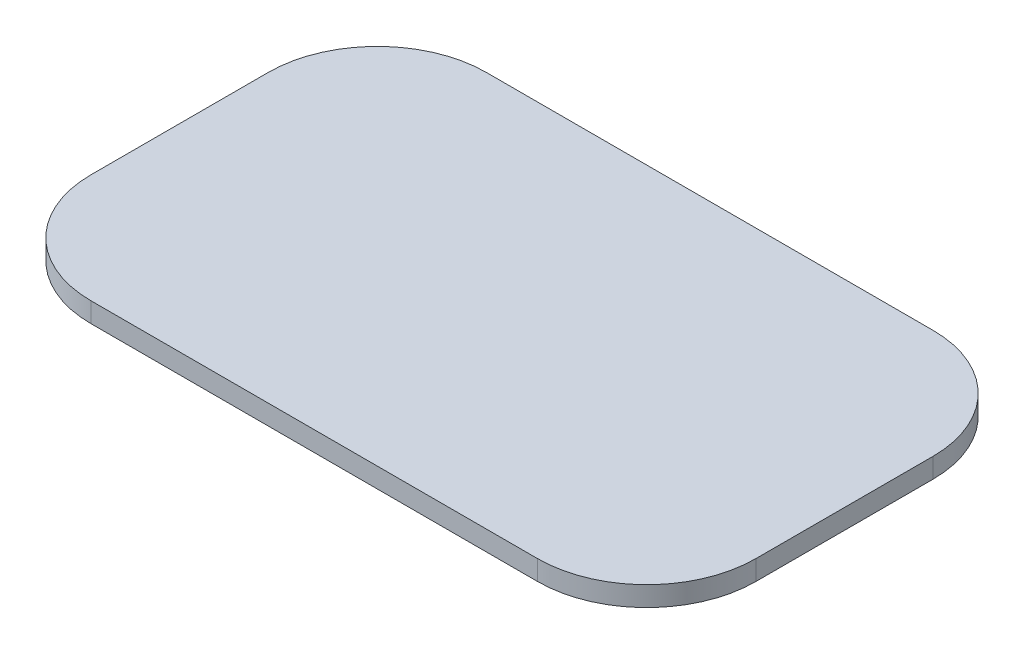
ISO-10303-21;
HEADER;
FILE_DESCRIPTION(('STEP AP214'),'2;1');
FILE_NAME('part.step','',(''),(''),'','','');
FILE_SCHEMA(('AUTOMOTIVE_DESIGN { 1 0 10303 214 1 1 1 1 }'));
ENDSEC;
DATA;
#1=APPLICATION_CONTEXT('core data for automotive mechanical design processes');
#2=APPLICATION_PROTOCOL_DEFINITION('international standard','automotive_design',2000,#1);
#3=PRODUCT_CONTEXT('',#1,'mechanical');
#4=PRODUCT('Part','Part','',(#3));
#5=PRODUCT_RELATED_PRODUCT_CATEGORY('part','',(#4));
#6=PRODUCT_DEFINITION_FORMATION('','',#4);
#7=PRODUCT_DEFINITION_CONTEXT('part definition',#1,'design');
#8=PRODUCT_DEFINITION('design','',#6,#7);
#9=PRODUCT_DEFINITION_SHAPE('','',#8);
#10=(LENGTH_UNIT() NAMED_UNIT(*) SI_UNIT(.MILLI.,.METRE.));
#11=(NAMED_UNIT(*) PLANE_ANGLE_UNIT() SI_UNIT($,.RADIAN.));
#12=(NAMED_UNIT(*) SI_UNIT($,.STERADIAN.) SOLID_ANGLE_UNIT());
#13=UNCERTAINTY_MEASURE_WITH_UNIT(LENGTH_MEASURE(1.E-05),#10,'distance_accuracy_value','');
#14=(GEOMETRIC_REPRESENTATION_CONTEXT(3) GLOBAL_UNCERTAINTY_ASSIGNED_CONTEXT((#13)) GLOBAL_UNIT_ASSIGNED_CONTEXT((#10,
#11,#12)) REPRESENTATION_CONTEXT('',''));
#15=CARTESIAN_POINT('',(0.,0.,0.));
#16=DIRECTION('',(0.,0.,1.));
#17=DIRECTION('',(1.,0.,0.));
#18=AXIS2_PLACEMENT_3D('',#15,#16,#17);
#19=CARTESIAN_POINT('',(-49.1774982545109,10.,0.));
#20=DIRECTION('',(1.,0.,0.));
#21=DIRECTION('',(0.,0.,-1.));
#22=AXIS2_PLACEMENT_3D('',#19,#20,#21);
#23=PLANE('',#22);
#24=DIRECTION('',(0.,0.,1.));
#25=VECTOR('',#24,1.);
#26=CARTESIAN_POINT('',(-49.1774982545109,0.,0.));
#27=LINE('',#26,#25);
#28=CARTESIAN_POINT('',(-49.1774982545109,0.,-12.2755631281144));
#29=VERTEX_POINT('',#28);
#30=CARTESIAN_POINT('',(-49.1774982545109,0.,76.986202656776));
#31=VERTEX_POINT('',#30);
#32=EDGE_CURVE('E206',#29,#31,#27,.T.);
#33=ORIENTED_EDGE('',*,*,#32,.T.);
#34=DIRECTION('',(0.,-1.,0.));
#35=VECTOR('',#34,1.);
#36=CARTESIAN_POINT('',(-49.1774982545109,10.,76.986202656776));
#37=LINE('',#36,#35);
#38=CARTESIAN_POINT('',(-49.1774982545109,10.,76.986202656776));
#39=VERTEX_POINT('',#38);
#40=EDGE_CURVE('E11',#39,#31,#37,.T.);
#41=ORIENTED_EDGE('',*,*,#40,.F.);
#42=DIRECTION('',(0.,0.,1.));
#43=VECTOR('',#42,1.);
#44=CARTESIAN_POINT('',(-49.1774982545109,10.,0.));
#45=LINE('',#44,#43);
#46=CARTESIAN_POINT('',(-49.1774982545109,10.,-12.2755631281144));
#47=VERTEX_POINT('',#46);
#48=EDGE_CURVE('E290',#47,#39,#45,.T.);
#49=ORIENTED_EDGE('',*,*,#48,.F.);
#50=DIRECTION('',(0.,-1.,0.));
#51=VECTOR('',#50,1.);
#52=CARTESIAN_POINT('',(-49.1774982545109,10.,-12.2755631281144));
#53=LINE('',#52,#51);
#54=EDGE_CURVE('E230',#47,#29,#53,.T.);
#55=ORIENTED_EDGE('',*,*,#54,.T.);
#56=EDGE_LOOP('',(#33,#41,#49,#55));
#57=FACE_BOUND('',#56,.T.);
#58=ADVANCED_FACE('F35',(#57),#23,.F.);
#59=CARTESIAN_POINT('',(-19.1774982545109,10.,76.986202656776));
#60=DIRECTION('',(0.,-1.,0.));
#61=DIRECTION('',(0.,0.,-1.));
#62=AXIS2_PLACEMENT_3D('',#59,#60,#61);
#63=CYLINDRICAL_SURFACE('',#62,30.);
#64=CARTESIAN_POINT('',(-19.1774982545109,0.,76.986202656776));
#65=DIRECTION('',(0.,1.,0.));
#66=DIRECTION('',(0.,0.,1.));
#67=AXIS2_PLACEMENT_3D('',#64,#65,#66);
#68=CIRCLE('',#67,30.);
#69=CARTESIAN_POINT('',(-19.1774982545109,0.,106.986202656776));
#70=VERTEX_POINT('',#69);
#71=EDGE_CURVE('E209',#31,#70,#68,.T.);
#72=ORIENTED_EDGE('',*,*,#71,.T.);
#73=DIRECTION('',(0.,-1.,0.));
#74=VECTOR('',#73,1.);
#75=CARTESIAN_POINT('',(-19.1774982545109,10.,106.986202656776));
#76=LINE('',#75,#74);
#77=CARTESIAN_POINT('',(-19.1774982545109,10.,106.986202656776));
#78=VERTEX_POINT('',#77);
#79=EDGE_CURVE('E45',#78,#70,#76,.T.);
#80=ORIENTED_EDGE('',*,*,#79,.F.);
#81=CARTESIAN_POINT('',(-19.1774982545109,10.,76.986202656776));
#82=DIRECTION('',(0.,1.,0.));
#83=DIRECTION('',(0.,0.,1.));
#84=AXIS2_PLACEMENT_3D('',#81,#82,#83);
#85=CIRCLE('',#84,30.);
#86=EDGE_CURVE('E293',#39,#78,#85,.T.);
#87=ORIENTED_EDGE('',*,*,#86,.F.);
#88=ORIENTED_EDGE('',*,*,#40,.T.);
#89=EDGE_LOOP('',(#72,#80,#87,#88));
#90=FACE_BOUND('',#89,.T.);
#91=ADVANCED_FACE('F324',(#90),#63,.T.);
#92=CARTESIAN_POINT('',(0.,10.,106.986202656776));
#93=DIRECTION('',(0.,0.,-1.));
#94=DIRECTION('',(-1.,0.,0.));
#95=AXIS2_PLACEMENT_3D('',#92,#93,#94);
#96=PLANE('',#95);
#97=DIRECTION('',(1.,0.,0.));
#98=VECTOR('',#97,1.);
#99=CARTESIAN_POINT('',(0.,0.,106.986202656776));
#100=LINE('',#99,#98);
#101=CARTESIAN_POINT('',(205.849333343495,0.,106.986202656776));
#102=VERTEX_POINT('',#101);
#103=EDGE_CURVE('E211',#70,#102,#100,.T.);
#104=ORIENTED_EDGE('',*,*,#103,.T.);
#105=DIRECTION('',(0.,-1.,0.));
#106=VECTOR('',#105,1.);
#107=CARTESIAN_POINT('',(205.849333343495,10.,106.986202656776));
#108=LINE('',#107,#106);
#109=CARTESIAN_POINT('',(205.849333343495,10.,106.986202656776));
#110=VERTEX_POINT('',#109);
#111=EDGE_CURVE('E239',#110,#102,#108,.T.);
#112=ORIENTED_EDGE('',*,*,#111,.F.);
#113=DIRECTION('',(1.,0.,0.));
#114=VECTOR('',#113,1.);
#115=CARTESIAN_POINT('',(0.,10.,106.986202656776));
#116=LINE('',#115,#114);
#117=EDGE_CURVE('E296',#78,#110,#116,.T.);
#118=ORIENTED_EDGE('',*,*,#117,.F.);
#119=ORIENTED_EDGE('',*,*,#79,.T.);
#120=EDGE_LOOP('',(#104,#112,#118,#119));
#121=FACE_BOUND('',#120,.T.);
#122=ADVANCED_FACE('F330',(#121),#96,.F.);
#123=CARTESIAN_POINT('',(205.849333343495,10.,76.9862026567759));
#124=DIRECTION('',(0.,-1.,0.));
#125=DIRECTION('',(0.,0.,-1.));
#126=AXIS2_PLACEMENT_3D('',#123,#124,#125);
#127=CYLINDRICAL_SURFACE('',#126,30.);
#128=CARTESIAN_POINT('',(205.849333343495,0.,76.9862026567759));
#129=DIRECTION('',(0.,1.,0.));
#130=DIRECTION('',(0.,0.,1.));
#131=AXIS2_PLACEMENT_3D('',#128,#129,#130);
#132=CIRCLE('',#131,30.);
#133=CARTESIAN_POINT('',(235.849333343495,0.,76.9862026567759));
#134=VERTEX_POINT('',#133);
#135=EDGE_CURVE('E213',#102,#134,#132,.T.);
#136=ORIENTED_EDGE('',*,*,#135,.T.);
#137=DIRECTION('',(0.,-1.,0.));
#138=VECTOR('',#137,1.);
#139=CARTESIAN_POINT('',(235.849333343495,10.,76.9862026567759));
#140=LINE('',#139,#138);
#141=CARTESIAN_POINT('',(235.849333343495,10.,76.9862026567759));
#142=VERTEX_POINT('',#141);
#143=EDGE_CURVE('E237',#142,#134,#140,.T.);
#144=ORIENTED_EDGE('',*,*,#143,.F.);
#145=CARTESIAN_POINT('',(205.849333343495,10.,76.9862026567759));
#146=DIRECTION('',(0.,1.,0.));
#147=DIRECTION('',(0.,0.,1.));
#148=AXIS2_PLACEMENT_3D('',#145,#146,#147);
#149=CIRCLE('',#148,30.);
#150=EDGE_CURVE('E299',#110,#142,#149,.T.);
#151=ORIENTED_EDGE('',*,*,#150,.F.);
#152=ORIENTED_EDGE('',*,*,#111,.T.);
#153=EDGE_LOOP('',(#136,#144,#151,#152));
#154=FACE_BOUND('',#153,.T.);
#155=ADVANCED_FACE('F308',(#154),#127,.T.);
#156=CARTESIAN_POINT('',(235.849333343495,10.,0.));
#157=DIRECTION('',(1.,0.,0.));
#158=DIRECTION('',(0.,0.,-1.));
#159=AXIS2_PLACEMENT_3D('',#156,#157,#158);
#160=PLANE('',#159);
#161=DIRECTION('',(0.,0.,1.));
#162=VECTOR('',#161,1.);
#163=CARTESIAN_POINT('',(235.849333343495,0.,0.));
#164=LINE('',#163,#162);
#165=CARTESIAN_POINT('',(235.849333343495,0.,16.3244368718856));
#166=VERTEX_POINT('',#165);
#167=EDGE_CURVE('E216',#166,#134,#164,.T.);
#168=ORIENTED_EDGE('',*,*,#167,.F.);
#169=DIRECTION('',(0.,-1.,0.));
#170=VECTOR('',#169,1.);
#171=CARTESIAN_POINT('',(235.849333343495,10.,16.3244368718856));
#172=LINE('',#171,#170);
#173=CARTESIAN_POINT('',(235.849333343495,10.,16.3244368718856));
#174=VERTEX_POINT('',#173);
#175=EDGE_CURVE('E235',#174,#166,#172,.T.);
#176=ORIENTED_EDGE('',*,*,#175,.F.);
#177=DIRECTION('',(0.,0.,1.));
#178=VECTOR('',#177,1.);
#179=CARTESIAN_POINT('',(235.849333343495,10.,0.));
#180=LINE('',#179,#178);
#181=EDGE_CURVE('E181',#174,#142,#180,.T.);
#182=ORIENTED_EDGE('',*,*,#181,.T.);
#183=ORIENTED_EDGE('',*,*,#143,.T.);
#184=EDGE_LOOP('',(#168,#176,#182,#183));
#185=FACE_BOUND('',#184,.T.);
#186=ADVANCED_FACE('F304',(#185),#160,.T.);
#187=CARTESIAN_POINT('',(0.,10.,16.3244368718856));
#188=DIRECTION('',(0.,0.,-1.));
#189=DIRECTION('',(-1.,0.,0.));
#190=AXIS2_PLACEMENT_3D('',#187,#188,#189);
#191=PLANE('',#190);
#192=DIRECTION('',(1.,0.,0.));
#193=VECTOR('',#192,1.);
#194=CARTESIAN_POINT('',(0.,0.,16.3244368718856));
#195=LINE('',#194,#193);
#196=CARTESIAN_POINT('',(147.322501745489,0.,16.3244368718856));
#197=VERTEX_POINT('',#196);
#198=EDGE_CURVE('E219',#197,#166,#195,.T.);
#199=ORIENTED_EDGE('',*,*,#198,.F.);
#200=DIRECTION('',(0.,-1.,0.));
#201=VECTOR('',#200,1.);
#202=CARTESIAN_POINT('',(147.322501745489,10.,16.3244368718856));
#203=LINE('',#202,#201);
#204=CARTESIAN_POINT('',(147.322501745489,10.,16.3244368718856));
#205=VERTEX_POINT('',#204);
#206=EDGE_CURVE('E165',#205,#197,#203,.T.);
#207=ORIENTED_EDGE('',*,*,#206,.F.);
#208=DIRECTION('',(1.,0.,0.));
#209=VECTOR('',#208,1.);
#210=CARTESIAN_POINT('',(0.,10.,16.3244368718856));
#211=LINE('',#210,#209);
#212=EDGE_CURVE('E179',#205,#174,#211,.T.);
#213=ORIENTED_EDGE('',*,*,#212,.T.);
#214=ORIENTED_EDGE('',*,*,#175,.T.);
#215=EDGE_LOOP('',(#199,#207,#213,#214));
#216=FACE_BOUND('',#215,.T.);
#217=ADVANCED_FACE('F314',(#216),#191,.T.);
#218=CARTESIAN_POINT('',(147.322501745489,10.,1.42972756541278E-13));
#219=DIRECTION('',(1.,0.,0.));
#220=DIRECTION('',(0.,0.,-1.));
#221=AXIS2_PLACEMENT_3D('',#218,#219,#220);
#222=PLANE('',#221);
#223=DIRECTION('',(0.,0.,1.));
#224=VECTOR('',#223,1.);
#225=CARTESIAN_POINT('',(147.322501745489,0.,1.42972756541278E-13));
#226=LINE('',#225,#224);
#227=CARTESIAN_POINT('',(147.322501745489,0.,-12.2755631281144));
#228=VERTEX_POINT('',#227);
#229=EDGE_CURVE('E161',#228,#197,#226,.T.);
#230=ORIENTED_EDGE('',*,*,#229,.F.);
#231=DIRECTION('',(0.,-1.,0.));
#232=VECTOR('',#231,1.);
#233=CARTESIAN_POINT('',(147.322501745489,10.,-12.2755631281144));
#234=LINE('',#233,#232);
#235=CARTESIAN_POINT('',(147.322501745489,10.,-12.2755631281144));
#236=VERTEX_POINT('',#235);
#237=EDGE_CURVE('E154',#236,#228,#234,.T.);
#238=ORIENTED_EDGE('',*,*,#237,.F.);
#239=DIRECTION('',(0.,0.,1.));
#240=VECTOR('',#239,1.);
#241=CARTESIAN_POINT('',(147.322501745489,10.,1.42972756541278E-13));
#242=LINE('',#241,#240);
#243=EDGE_CURVE('E158',#236,#205,#242,.T.);
#244=ORIENTED_EDGE('',*,*,#243,.T.);
#245=ORIENTED_EDGE('',*,*,#206,.T.);
#246=EDGE_LOOP('',(#230,#238,#244,#245));
#247=FACE_BOUND('',#246,.T.);
#248=ADVANCED_FACE('F156',(#247),#222,.T.);
#249=CARTESIAN_POINT('',(117.322501745489,10.,-12.2755631281144));
#250=DIRECTION('',(0.,-1.,0.));
#251=DIRECTION('',(0.,0.,-1.));
#252=AXIS2_PLACEMENT_3D('',#249,#250,#251);
#253=CYLINDRICAL_SURFACE('',#252,30.);
#254=CARTESIAN_POINT('',(117.322501745489,0.,-12.2755631281144));
#255=DIRECTION('',(0.,1.,0.));
#256=DIRECTION('',(0.,0.,1.));
#257=AXIS2_PLACEMENT_3D('',#254,#255,#256);
#258=CIRCLE('',#257,30.);
#259=CARTESIAN_POINT('',(117.322501745489,0.,-42.2755631281144));
#260=VERTEX_POINT('',#259);
#261=EDGE_CURVE('E223',#260,#228,#258,.F.);
#262=ORIENTED_EDGE('',*,*,#261,.F.);
#263=DIRECTION('',(0.,-1.,0.));
#264=VECTOR('',#263,1.);
#265=CARTESIAN_POINT('',(117.322501745489,10.,-42.2755631281144));
#266=LINE('',#265,#264);
#267=CARTESIAN_POINT('',(117.322501745489,10.,-42.2755631281144));
#268=VERTEX_POINT('',#267);
#269=EDGE_CURVE('E166',#268,#260,#266,.T.);
#270=ORIENTED_EDGE('',*,*,#269,.F.);
#271=CARTESIAN_POINT('',(117.322501745489,10.,-12.2755631281144));
#272=DIRECTION('',(0.,1.,0.));
#273=DIRECTION('',(0.,0.,1.));
#274=AXIS2_PLACEMENT_3D('',#271,#272,#273);
#275=CIRCLE('',#274,30.);
#276=EDGE_CURVE('E169',#268,#236,#275,.F.);
#277=ORIENTED_EDGE('',*,*,#276,.T.);
#278=ORIENTED_EDGE('',*,*,#237,.T.);
#279=EDGE_LOOP('',(#262,#270,#277,#278));
#280=FACE_BOUND('',#279,.T.);
#281=ADVANCED_FACE('F170',(#280),#253,.T.);
#282=CARTESIAN_POINT('',(0.,10.,-42.2755631281144));
#283=DIRECTION('',(0.,0.,-1.));
#284=DIRECTION('',(-1.,0.,0.));
#285=AXIS2_PLACEMENT_3D('',#282,#283,#284);
#286=PLANE('',#285);
#287=DIRECTION('',(1.,0.,0.));
#288=VECTOR('',#287,1.);
#289=CARTESIAN_POINT('',(0.,0.,-42.2755631281144));
#290=LINE('',#289,#288);
#291=CARTESIAN_POINT('',(-19.1774982545109,0.,-42.2755631281144));
#292=VERTEX_POINT('',#291);
#293=EDGE_CURVE('E225',#292,#260,#290,.T.);
#294=ORIENTED_EDGE('',*,*,#293,.F.);
#295=DIRECTION('',(0.,-1.,0.));
#296=VECTOR('',#295,1.);
#297=CARTESIAN_POINT('',(-19.1774982545109,10.,-42.2755631281144));
#298=LINE('',#297,#296);
#299=CARTESIAN_POINT('',(-19.1774982545109,10.,-42.2755631281144));
#300=VERTEX_POINT('',#299);
#301=EDGE_CURVE('E54',#300,#292,#298,.T.);
#302=ORIENTED_EDGE('',*,*,#301,.F.);
#303=DIRECTION('',(1.,0.,0.));
#304=VECTOR('',#303,1.);
#305=CARTESIAN_POINT('',(0.,10.,-42.2755631281144));
#306=LINE('',#305,#304);
#307=EDGE_CURVE('E173',#300,#268,#306,.T.);
#308=ORIENTED_EDGE('',*,*,#307,.T.);
#309=ORIENTED_EDGE('',*,*,#269,.T.);
#310=EDGE_LOOP('',(#294,#302,#308,#309));
#311=FACE_BOUND('',#310,.T.);
#312=ADVANCED_FACE('F351',(#311),#286,.T.);
#313=CARTESIAN_POINT('',(0.,10.,34.2681541304497));
#314=DIRECTION('',(0.,0.,-1.));
#315=DIRECTION('',(-1.,0.,0.));
#316=AXIS2_PLACEMENT_3D('',#313,#314,#315);
#317=PLANE('',#316);
#318=DIRECTION('',(1.,0.,0.));
#319=VECTOR('',#318,1.);
#320=CARTESIAN_POINT('',(0.,0.,34.2681541304497));
#321=LINE('',#320,#319);
#322=CARTESIAN_POINT('',(134.144584588579,0.,34.2681541304497));
#323=VERTEX_POINT('',#322);
#324=CARTESIAN_POINT('',(216.644584588579,0.,34.2681541304497));
#325=VERTEX_POINT('',#324);
#326=EDGE_CURVE('E189',#323,#325,#321,.T.);
#327=ORIENTED_EDGE('',*,*,#326,.T.);
#328=DIRECTION('',(0.,-1.,0.));
#329=VECTOR('',#328,1.);
#330=CARTESIAN_POINT('',(216.644584588579,10.,34.2681541304497));
#331=LINE('',#330,#329);
#332=CARTESIAN_POINT('',(216.644584588579,10.,34.2681541304497));
#333=VERTEX_POINT('',#332);
#334=EDGE_CURVE('E39',#333,#325,#331,.T.);
#335=ORIENTED_EDGE('',*,*,#334,.F.);
#336=DIRECTION('',(1.,0.,0.));
#337=VECTOR('',#336,1.);
#338=CARTESIAN_POINT('',(0.,10.,34.2681541304497));
#339=LINE('',#338,#337);
#340=CARTESIAN_POINT('',(134.144584588579,10.,34.2681541304497));
#341=VERTEX_POINT('',#340);
#342=EDGE_CURVE('E229',#341,#333,#339,.T.);
#343=ORIENTED_EDGE('',*,*,#342,.F.);
#344=DIRECTION('',(0.,-1.,0.));
#345=VECTOR('',#344,1.);
#346=CARTESIAN_POINT('',(134.144584588579,10.,34.2681541304497));
#347=LINE('',#346,#345);
#348=EDGE_CURVE('E188',#341,#323,#347,.T.);
#349=ORIENTED_EDGE('',*,*,#348,.T.);
#350=EDGE_LOOP('',(#327,#335,#343,#349));
#351=FACE_BOUND('',#350,.T.);
#352=ADVANCED_FACE('F37',(#351),#317,.F.);
#353=CARTESIAN_POINT('',(216.644584588579,10.,0.));
#354=DIRECTION('',(1.,0.,0.));
#355=DIRECTION('',(0.,0.,-1.));
#356=AXIS2_PLACEMENT_3D('',#353,#354,#355);
#357=PLANE('',#356);
#358=DIRECTION('',(0.,0.,1.));
#359=VECTOR('',#358,1.);
#360=CARTESIAN_POINT('',(216.644584588579,0.,0.));
#361=LINE('',#360,#359);
#362=CARTESIAN_POINT('',(216.644584588579,0.,86.2681541304497));
#363=VERTEX_POINT('',#362);
#364=EDGE_CURVE('E192',#325,#363,#361,.T.);
#365=ORIENTED_EDGE('',*,*,#364,.T.);
#366=DIRECTION('',(0.,-1.,0.));
#367=VECTOR('',#366,1.);
#368=CARTESIAN_POINT('',(216.644584588579,10.,86.2681541304497));
#369=LINE('',#368,#367);
#370=CARTESIAN_POINT('',(216.644584588579,10.,86.2681541304497));
#371=VERTEX_POINT('',#370);
#372=EDGE_CURVE('E252',#371,#363,#369,.T.);
#373=ORIENTED_EDGE('',*,*,#372,.F.);
#374=DIRECTION('',(0.,0.,1.));
#375=VECTOR('',#374,1.);
#376=CARTESIAN_POINT('',(216.644584588579,10.,0.));
#377=LINE('',#376,#375);
#378=EDGE_CURVE('E118',#333,#371,#377,.T.);
#379=ORIENTED_EDGE('',*,*,#378,.F.);
#380=ORIENTED_EDGE('',*,*,#334,.T.);
#381=EDGE_LOOP('',(#365,#373,#379,#380));
#382=FACE_BOUND('',#381,.T.);
#383=ADVANCED_FACE('F256',(#382),#357,.F.);
#384=CARTESIAN_POINT('',(0.,10.,86.2681541304497));
#385=DIRECTION('',(0.,0.,-1.));
#386=DIRECTION('',(-1.,0.,0.));
#387=AXIS2_PLACEMENT_3D('',#384,#385,#386);
#388=PLANE('',#387);
#389=DIRECTION('',(1.,0.,0.));
#390=VECTOR('',#389,1.);
#391=CARTESIAN_POINT('',(0.,0.,86.2681541304497));
#392=LINE('',#391,#390);
#393=CARTESIAN_POINT('',(-30.8554154114209,0.,86.2681541304497));
#394=VERTEX_POINT('',#393);
#395=EDGE_CURVE('E196',#394,#363,#392,.T.);
#396=ORIENTED_EDGE('',*,*,#395,.F.);
#397=DIRECTION('',(0.,-1.,0.));
#398=VECTOR('',#397,1.);
#399=CARTESIAN_POINT('',(-30.8554154114209,10.,86.2681541304497));
#400=LINE('',#399,#398);
#401=CARTESIAN_POINT('',(-30.8554154114209,10.,86.2681541304497));
#402=VERTEX_POINT('',#401);
#403=EDGE_CURVE('E251',#402,#394,#400,.T.);
#404=ORIENTED_EDGE('',*,*,#403,.F.);
#405=DIRECTION('',(1.,0.,0.));
#406=VECTOR('',#405,1.);
#407=CARTESIAN_POINT('',(0.,10.,86.2681541304497));
#408=LINE('',#407,#406);
#409=EDGE_CURVE('E271',#402,#371,#408,.T.);
#410=ORIENTED_EDGE('',*,*,#409,.T.);
#411=ORIENTED_EDGE('',*,*,#372,.T.);
#412=EDGE_LOOP('',(#396,#404,#410,#411));
#413=FACE_BOUND('',#412,.T.);
#414=ADVANCED_FACE('F268',(#413),#388,.T.);
#415=CARTESIAN_POINT('',(-30.8554154114209,10.,0.));
#416=DIRECTION('',(1.,0.,0.));
#417=DIRECTION('',(0.,0.,-1.));
#418=AXIS2_PLACEMENT_3D('',#415,#416,#417);
#419=PLANE('',#418);
#420=DIRECTION('',(0.,0.,1.));
#421=VECTOR('',#420,1.);
#422=CARTESIAN_POINT('',(-30.8554154114209,0.,0.));
#423=LINE('',#422,#421);
#424=CARTESIAN_POINT('',(-30.8554154114209,0.,-17.7318458695503));
#425=VERTEX_POINT('',#424);
#426=EDGE_CURVE('E199',#425,#394,#423,.T.);
#427=ORIENTED_EDGE('',*,*,#426,.F.);
#428=DIRECTION('',(0.,-1.,0.));
#429=VECTOR('',#428,1.);
#430=CARTESIAN_POINT('',(-30.8554154114209,10.,-17.7318458695503));
#431=LINE('',#430,#429);
#432=CARTESIAN_POINT('',(-30.8554154114209,10.,-17.7318458695503));
#433=VERTEX_POINT('',#432);
#434=EDGE_CURVE('E249',#433,#425,#431,.T.);
#435=ORIENTED_EDGE('',*,*,#434,.F.);
#436=DIRECTION('',(0.,0.,1.));
#437=VECTOR('',#436,1.);
#438=CARTESIAN_POINT('',(-30.8554154114209,10.,0.));
#439=LINE('',#438,#437);
#440=EDGE_CURVE('E274',#433,#402,#439,.T.);
#441=ORIENTED_EDGE('',*,*,#440,.T.);
#442=ORIENTED_EDGE('',*,*,#403,.T.);
#443=EDGE_LOOP('',(#427,#435,#441,#442));
#444=FACE_BOUND('',#443,.T.);
#445=ADVANCED_FACE('F275',(#444),#419,.T.);
#446=CARTESIAN_POINT('',(0.,10.,-17.7318458695503));
#447=DIRECTION('',(0.,0.,-1.));
#448=DIRECTION('',(-1.,0.,0.));
#449=AXIS2_PLACEMENT_3D('',#446,#447,#448);
#450=PLANE('',#449);
#451=DIRECTION('',(1.,0.,0.));
#452=VECTOR('',#451,1.);
#453=CARTESIAN_POINT('',(0.,0.,-17.7318458695503));
#454=LINE('',#453,#452);
#455=CARTESIAN_POINT('',(134.144584588579,0.,-17.7318458695503));
#456=VERTEX_POINT('',#455);
#457=EDGE_CURVE('E202',#425,#456,#454,.T.);
#458=ORIENTED_EDGE('',*,*,#457,.T.);
#459=DIRECTION('',(0.,-1.,0.));
#460=VECTOR('',#459,1.);
#461=CARTESIAN_POINT('',(134.144584588579,10.,-17.7318458695503));
#462=LINE('',#461,#460);
#463=CARTESIAN_POINT('',(134.144584588579,10.,-17.7318458695503));
#464=VERTEX_POINT('',#463);
#465=EDGE_CURVE('E246',#464,#456,#462,.T.);
#466=ORIENTED_EDGE('',*,*,#465,.F.);
#467=DIRECTION('',(1.,0.,0.));
#468=VECTOR('',#467,1.);
#469=CARTESIAN_POINT('',(0.,10.,-17.7318458695503));
#470=LINE('',#469,#468);
#471=EDGE_CURVE('E279',#433,#464,#470,.T.);
#472=ORIENTED_EDGE('',*,*,#471,.F.);
#473=ORIENTED_EDGE('',*,*,#434,.T.);
#474=EDGE_LOOP('',(#458,#466,#472,#473));
#475=FACE_BOUND('',#474,.T.);
#476=ADVANCED_FACE('F339',(#475),#450,.F.);
#477=CARTESIAN_POINT('',(134.144584588579,10.,0.));
#478=DIRECTION('',(1.,0.,0.));
#479=DIRECTION('',(0.,0.,-1.));
#480=AXIS2_PLACEMENT_3D('',#477,#478,#479);
#481=PLANE('',#480);
#482=DIRECTION('',(0.,0.,1.));
#483=VECTOR('',#482,1.);
#484=CARTESIAN_POINT('',(134.144584588579,0.,0.));
#485=LINE('',#484,#483);
#486=EDGE_CURVE('E204',#456,#323,#485,.T.);
#487=ORIENTED_EDGE('',*,*,#486,.T.);
#488=ORIENTED_EDGE('',*,*,#348,.F.);
#489=DIRECTION('',(0.,0.,1.));
#490=VECTOR('',#489,1.);
#491=CARTESIAN_POINT('',(134.144584588579,10.,0.));
#492=LINE('',#491,#490);
#493=EDGE_CURVE('E288',#464,#341,#492,.T.);
#494=ORIENTED_EDGE('',*,*,#493,.F.);
#495=ORIENTED_EDGE('',*,*,#465,.T.);
#496=EDGE_LOOP('',(#487,#488,#494,#495));
#497=FACE_BOUND('',#496,.T.);
#498=ADVANCED_FACE('F335',(#497),#481,.F.);
#499=CARTESIAN_POINT('',(-19.1774982545109,10.,-12.2755631281144));
#500=DIRECTION('',(0.,-1.,0.));
#501=DIRECTION('',(0.,0.,-1.));
#502=AXIS2_PLACEMENT_3D('',#499,#500,#501);
#503=CYLINDRICAL_SURFACE('',#502,30.);
#504=CARTESIAN_POINT('',(-19.1774982545109,0.,-12.2755631281144));
#505=DIRECTION('',(0.,1.,0.));
#506=DIRECTION('',(0.,0.,1.));
#507=AXIS2_PLACEMENT_3D('',#504,#505,#506);
#508=CIRCLE('',#507,30.);
#509=EDGE_CURVE('E109',#292,#29,#508,.T.);
#510=ORIENTED_EDGE('',*,*,#509,.T.);
#511=ORIENTED_EDGE('',*,*,#54,.F.);
#512=CARTESIAN_POINT('',(-19.1774982545109,10.,-12.2755631281144));
#513=DIRECTION('',(0.,1.,0.));
#514=DIRECTION('',(0.,0.,1.));
#515=AXIS2_PLACEMENT_3D('',#512,#513,#514);
#516=CIRCLE('',#515,30.);
#517=EDGE_CURVE('E186',#300,#47,#516,.T.);
#518=ORIENTED_EDGE('',*,*,#517,.F.);
#519=ORIENTED_EDGE('',*,*,#301,.T.);
#520=EDGE_LOOP('',(#510,#511,#518,#519));
#521=FACE_BOUND('',#520,.T.);
#522=ADVANCED_FACE('F338',(#521),#503,.T.);
#523=CARTESIAN_POINT('',(0.,0.,0.));
#524=DIRECTION('',(0.,1.,0.));
#525=DIRECTION('',(0.,0.,1.));
#526=AXIS2_PLACEMENT_3D('',#523,#524,#525);
#527=PLANE('',#526);
#528=ORIENTED_EDGE('',*,*,#326,.F.);
#529=ORIENTED_EDGE('',*,*,#486,.F.);
#530=ORIENTED_EDGE('',*,*,#457,.F.);
#531=ORIENTED_EDGE('',*,*,#426,.T.);
#532=ORIENTED_EDGE('',*,*,#395,.T.);
#533=ORIENTED_EDGE('',*,*,#364,.F.);
#534=EDGE_LOOP('',(#528,#529,#530,#531,#532,#533));
#535=FACE_BOUND('',#534,.T.);
#536=ORIENTED_EDGE('',*,*,#32,.F.);
#537=ORIENTED_EDGE('',*,*,#509,.F.);
#538=ORIENTED_EDGE('',*,*,#293,.T.);
#539=ORIENTED_EDGE('',*,*,#261,.T.);
#540=ORIENTED_EDGE('',*,*,#229,.T.);
#541=ORIENTED_EDGE('',*,*,#198,.T.);
#542=ORIENTED_EDGE('',*,*,#167,.T.);
#543=ORIENTED_EDGE('',*,*,#135,.F.);
#544=ORIENTED_EDGE('',*,*,#103,.F.);
#545=ORIENTED_EDGE('',*,*,#71,.F.);
#546=EDGE_LOOP('',(#536,#537,#538,#539,#540,#541,#542,#543,#544,#545));
#547=FACE_BOUND('',#546,.T.);
#548=ADVANCED_FACE('F264',(#535,#547),#527,.F.);
#549=CARTESIAN_POINT('',(-19.1774982545109,20.,-12.2755631281144));
#550=DIRECTION('',(0.,1.,0.));
#551=DIRECTION('',(0.,0.,1.));
#552=AXIS2_PLACEMENT_3D('',#549,#550,#551);
#553=PLANE('',#552);
#554=CARTESIAN_POINT('',(-19.1774982545109,20.,-12.2755631281144));
#555=DIRECTION('',(0.,1.,0.));
#556=DIRECTION('',(0.,0.,1.));
#557=AXIS2_PLACEMENT_3D('',#554,#555,#556);
#558=CIRCLE('',#557,55.);
#559=CARTESIAN_POINT('',(-19.1774982545109,20.,-67.2755631281144));
#560=VERTEX_POINT('',#559);
#561=CARTESIAN_POINT('',(-74.1774982545109,20.,-12.2755631281144));
#562=VERTEX_POINT('',#561);
#563=EDGE_CURVE('E409',#560,#562,#558,.T.);
#564=ORIENTED_EDGE('',*,*,#563,.T.);
#565=DIRECTION('',(0.,0.,1.));
#566=VECTOR('',#565,1.);
#567=CARTESIAN_POINT('',(-74.1774982545109,20.,-12.2755631281144));
#568=LINE('',#567,#566);
#569=CARTESIAN_POINT('',(-74.1774982545109,20.,76.986202656776));
#570=VERTEX_POINT('',#569);
#571=EDGE_CURVE('E414',#562,#570,#568,.T.);
#572=ORIENTED_EDGE('',*,*,#571,.T.);
#573=CARTESIAN_POINT('',(-19.1774982545109,20.,76.986202656776));
#574=DIRECTION('',(0.,1.,0.));
#575=DIRECTION('',(0.,0.,1.));
#576=AXIS2_PLACEMENT_3D('',#573,#574,#575);
#577=CIRCLE('',#576,55.);
#578=CARTESIAN_POINT('',(-19.1774982545109,20.,131.986202656776));
#579=VERTEX_POINT('',#578);
#580=EDGE_CURVE('E479',#570,#579,#577,.T.);
#581=ORIENTED_EDGE('',*,*,#580,.T.);
#582=DIRECTION('',(1.,0.,0.));
#583=VECTOR('',#582,1.);
#584=CARTESIAN_POINT('',(-19.1774982545109,20.,131.986202656776));
#585=LINE('',#584,#583);
#586=CARTESIAN_POINT('',(205.849333343495,20.,131.986202656776));
#587=VERTEX_POINT('',#586);
#588=EDGE_CURVE('E482',#579,#587,#585,.T.);
#589=ORIENTED_EDGE('',*,*,#588,.T.);
#590=CARTESIAN_POINT('',(205.849333343495,20.,76.9862026567759));
#591=DIRECTION('',(0.,1.,0.));
#592=DIRECTION('',(0.,0.,1.));
#593=AXIS2_PLACEMENT_3D('',#590,#591,#592);
#594=CIRCLE('',#593,55.);
#595=CARTESIAN_POINT('',(260.849333343495,20.,76.9862026567759));
#596=VERTEX_POINT('',#595);
#597=EDGE_CURVE('E492',#587,#596,#594,.T.);
#598=ORIENTED_EDGE('',*,*,#597,.T.);
#599=DIRECTION('',(0.,0.,-1.));
#600=VECTOR('',#599,1.);
#601=CARTESIAN_POINT('',(260.849333343495,20.,76.9862026567759));
#602=LINE('',#601,#600);
#603=CARTESIAN_POINT('',(260.849333343495,20.,-12.275563128114));
#604=VERTEX_POINT('',#603);
#605=EDGE_CURVE('E494',#596,#604,#602,.T.);
#606=ORIENTED_EDGE('',*,*,#605,.T.);
#607=CARTESIAN_POINT('',(205.849333343495,20.,-12.2755631281144));
#608=DIRECTION('',(0.,1.,0.));
#609=DIRECTION('',(0.,0.,1.));
#610=AXIS2_PLACEMENT_3D('',#607,#608,#609);
#611=CIRCLE('',#610,55.);
#612=CARTESIAN_POINT('',(205.849333343495,20.,-67.2755631281144));
#613=VERTEX_POINT('',#612);
#614=EDGE_CURVE('E499',#604,#613,#611,.T.);
#615=ORIENTED_EDGE('',*,*,#614,.T.);
#616=DIRECTION('',(1.,0.,0.));
#617=VECTOR('',#616,1.);
#618=CARTESIAN_POINT('',(117.322501745489,20.,-67.2755631281144));
#619=LINE('',#618,#617);
#620=EDGE_CURVE('E419',#560,#613,#619,.T.);
#621=ORIENTED_EDGE('',*,*,#620,.F.);
#622=EDGE_LOOP('',(#564,#572,#581,#589,#598,#606,#615,#621));
#623=FACE_BOUND('',#622,.T.);
#624=ADVANCED_FACE('F365',(#623),#553,.T.);
#625=CARTESIAN_POINT('',(117.322501745489,20.,-67.2755631281144));
#626=DIRECTION('',(0.,0.,1.));
#627=DIRECTION('',(1.,0.,0.));
#628=AXIS2_PLACEMENT_3D('',#625,#626,#627);
#629=PLANE('',#628);
#630=DIRECTION('',(-1.,0.,0.));
#631=VECTOR('',#630,1.);
#632=CARTESIAN_POINT('',(117.322501745489,10.,-67.2755631281144));
#633=LINE('',#632,#631);
#634=CARTESIAN_POINT('',(205.849333343495,10.,-67.2755631281144));
#635=VERTEX_POINT('',#634);
#636=CARTESIAN_POINT('',(-19.1774982545109,10.,-67.2755631281144));
#637=VERTEX_POINT('',#636);
#638=EDGE_CURVE('E424',#635,#637,#633,.T.);
#639=ORIENTED_EDGE('',*,*,#638,.T.);
#640=DIRECTION('',(0.,-1.,0.));
#641=VECTOR('',#640,1.);
#642=CARTESIAN_POINT('',(-19.1774982545109,20.,-67.2755631281144));
#643=LINE('',#642,#641);
#644=EDGE_CURVE('E502',#560,#637,#643,.T.);
#645=ORIENTED_EDGE('',*,*,#644,.F.);
#646=ORIENTED_EDGE('',*,*,#620,.T.);
#647=DIRECTION('',(0.,-1.,0.));
#648=VECTOR('',#647,1.);
#649=CARTESIAN_POINT('',(205.849333343495,20.,-67.2755631281144));
#650=LINE('',#649,#648);
#651=EDGE_CURVE('E519',#613,#635,#650,.T.);
#652=ORIENTED_EDGE('',*,*,#651,.T.);
#653=EDGE_LOOP('',(#639,#645,#646,#652));
#654=FACE_BOUND('',#653,.T.);
#655=ADVANCED_FACE('F393',(#654),#629,.F.);
#656=CARTESIAN_POINT('',(205.849333343495,20.,-12.2755631281144));
#657=DIRECTION('',(0.,-1.,0.));
#658=DIRECTION('',(0.,0.,-1.));
#659=AXIS2_PLACEMENT_3D('',#656,#657,#658);
#660=CYLINDRICAL_SURFACE('',#659,55.);
#661=CARTESIAN_POINT('',(205.849333343495,10.,-12.2755631281144));
#662=DIRECTION('',(0.,1.,0.));
#663=DIRECTION('',(0.,0.,1.));
#664=AXIS2_PLACEMENT_3D('',#661,#662,#663);
#665=CIRCLE('',#664,55.);
#666=CARTESIAN_POINT('',(260.849333343495,10.,-12.275563128114));
#667=VERTEX_POINT('',#666);
#668=EDGE_CURVE('E514',#667,#635,#665,.T.);
#669=ORIENTED_EDGE('',*,*,#668,.T.);
#670=ORIENTED_EDGE('',*,*,#651,.F.);
#671=ORIENTED_EDGE('',*,*,#614,.F.);
#672=DIRECTION('',(0.,-1.,0.));
#673=VECTOR('',#672,1.);
#674=CARTESIAN_POINT('',(260.849333343495,20.,-12.275563128114));
#675=LINE('',#674,#673);
#676=EDGE_CURVE('E522',#604,#667,#675,.T.);
#677=ORIENTED_EDGE('',*,*,#676,.T.);
#678=EDGE_LOOP('',(#669,#670,#671,#677));
#679=FACE_BOUND('',#678,.T.);
#680=ADVANCED_FACE('F389',(#679),#660,.T.);
#681=CARTESIAN_POINT('',(260.849333343495,20.,-12.275563128114));
#682=DIRECTION('',(1.,0.,0.));
#683=DIRECTION('',(0.,0.,-1.));
#684=AXIS2_PLACEMENT_3D('',#681,#682,#683);
#685=PLANE('',#684);
#686=DIRECTION('',(0.,0.,1.));
#687=VECTOR('',#686,1.);
#688=CARTESIAN_POINT('',(260.849333343495,10.,-12.275563128114));
#689=LINE('',#688,#687);
#690=CARTESIAN_POINT('',(260.849333343495,10.,76.9862026567759));
#691=VERTEX_POINT('',#690);
#692=EDGE_CURVE('E512',#667,#691,#689,.T.);
#693=ORIENTED_EDGE('',*,*,#692,.F.);
#694=ORIENTED_EDGE('',*,*,#676,.F.);
#695=ORIENTED_EDGE('',*,*,#605,.F.);
#696=DIRECTION('',(0.,-1.,0.));
#697=VECTOR('',#696,1.);
#698=CARTESIAN_POINT('',(260.849333343495,20.,76.9862026567759));
#699=LINE('',#698,#697);
#700=EDGE_CURVE('E524',#596,#691,#699,.T.);
#701=ORIENTED_EDGE('',*,*,#700,.T.);
#702=EDGE_LOOP('',(#693,#694,#695,#701));
#703=FACE_BOUND('',#702,.T.);
#704=ADVANCED_FACE('F385',(#703),#685,.T.);
#705=CARTESIAN_POINT('',(205.849333343495,20.,76.9862026567759));
#706=DIRECTION('',(0.,-1.,0.));
#707=DIRECTION('',(0.,0.,-1.));
#708=AXIS2_PLACEMENT_3D('',#705,#706,#707);
#709=CYLINDRICAL_SURFACE('',#708,55.);
#710=CARTESIAN_POINT('',(205.849333343495,10.,76.9862026567759));
#711=DIRECTION('',(0.,1.,0.));
#712=DIRECTION('',(0.,0.,1.));
#713=AXIS2_PLACEMENT_3D('',#710,#711,#712);
#714=CIRCLE('',#713,55.);
#715=CARTESIAN_POINT('',(205.849333343495,10.,131.986202656776));
#716=VERTEX_POINT('',#715);
#717=EDGE_CURVE('E509',#716,#691,#714,.T.);
#718=ORIENTED_EDGE('',*,*,#717,.T.);
#719=ORIENTED_EDGE('',*,*,#700,.F.);
#720=ORIENTED_EDGE('',*,*,#597,.F.);
#721=DIRECTION('',(0.,-1.,0.));
#722=VECTOR('',#721,1.);
#723=CARTESIAN_POINT('',(205.849333343495,20.,131.986202656776));
#724=LINE('',#723,#722);
#725=EDGE_CURVE('E489',#587,#716,#724,.T.);
#726=ORIENTED_EDGE('',*,*,#725,.T.);
#727=EDGE_LOOP('',(#718,#719,#720,#726));
#728=FACE_BOUND('',#727,.T.);
#729=ADVANCED_FACE('F381',(#728),#709,.T.);
#730=CARTESIAN_POINT('',(-19.1774982545109,20.,131.986202656776));
#731=DIRECTION('',(0.,0.,-1.));
#732=DIRECTION('',(-1.,0.,0.));
#733=AXIS2_PLACEMENT_3D('',#730,#731,#732);
#734=PLANE('',#733);
#735=DIRECTION('',(1.,0.,0.));
#736=VECTOR('',#735,1.);
#737=CARTESIAN_POINT('',(-19.1774982545109,10.,131.986202656776));
#738=LINE('',#737,#736);
#739=CARTESIAN_POINT('',(-19.1774982545109,10.,131.986202656776));
#740=VERTEX_POINT('',#739);
#741=EDGE_CURVE('E507',#740,#716,#738,.T.);
#742=ORIENTED_EDGE('',*,*,#741,.T.);
#743=ORIENTED_EDGE('',*,*,#725,.F.);
#744=ORIENTED_EDGE('',*,*,#588,.F.);
#745=DIRECTION('',(0.,-1.,0.));
#746=VECTOR('',#745,1.);
#747=CARTESIAN_POINT('',(-19.1774982545109,20.,131.986202656776));
#748=LINE('',#747,#746);
#749=EDGE_CURVE('E435',#579,#740,#748,.T.);
#750=ORIENTED_EDGE('',*,*,#749,.T.);
#751=EDGE_LOOP('',(#742,#743,#744,#750));
#752=FACE_BOUND('',#751,.T.);
#753=ADVANCED_FACE('F377',(#752),#734,.F.);
#754=CARTESIAN_POINT('',(-19.1774982545109,20.,76.986202656776));
#755=DIRECTION('',(0.,-1.,0.));
#756=DIRECTION('',(0.,0.,-1.));
#757=AXIS2_PLACEMENT_3D('',#754,#755,#756);
#758=CYLINDRICAL_SURFACE('',#757,55.);
#759=CARTESIAN_POINT('',(-19.1774982545109,10.,76.986202656776));
#760=DIRECTION('',(0.,1.,0.));
#761=DIRECTION('',(0.,0.,1.));
#762=AXIS2_PLACEMENT_3D('',#759,#760,#761);
#763=CIRCLE('',#762,55.);
#764=CARTESIAN_POINT('',(-74.1774982545109,10.,76.986202656776));
#765=VERTEX_POINT('',#764);
#766=EDGE_CURVE('E487',#765,#740,#763,.T.);
#767=ORIENTED_EDGE('',*,*,#766,.T.);
#768=ORIENTED_EDGE('',*,*,#749,.F.);
#769=ORIENTED_EDGE('',*,*,#580,.F.);
#770=DIRECTION('',(0.,-1.,0.));
#771=VECTOR('',#770,1.);
#772=CARTESIAN_POINT('',(-74.1774982545109,20.,76.986202656776));
#773=LINE('',#772,#771);
#774=EDGE_CURVE('E432',#570,#765,#773,.T.);
#775=ORIENTED_EDGE('',*,*,#774,.T.);
#776=EDGE_LOOP('',(#767,#768,#769,#775));
#777=FACE_BOUND('',#776,.T.);
#778=ADVANCED_FACE('F373',(#777),#758,.T.);
#779=CARTESIAN_POINT('',(-74.1774982545109,20.,-12.2755631281144));
#780=DIRECTION('',(1.,0.,0.));
#781=DIRECTION('',(0.,0.,-1.));
#782=AXIS2_PLACEMENT_3D('',#779,#780,#781);
#783=PLANE('',#782);
#784=DIRECTION('',(0.,0.,1.));
#785=VECTOR('',#784,1.);
#786=CARTESIAN_POINT('',(-74.1774982545109,10.,-12.2755631281144));
#787=LINE('',#786,#785);
#788=CARTESIAN_POINT('',(-74.1774982545109,10.,-12.2755631281144));
#789=VERTEX_POINT('',#788);
#790=EDGE_CURVE('E504',#789,#765,#787,.T.);
#791=ORIENTED_EDGE('',*,*,#790,.T.);
#792=ORIENTED_EDGE('',*,*,#774,.F.);
#793=ORIENTED_EDGE('',*,*,#571,.F.);
#794=DIRECTION('',(0.,-1.,0.));
#795=VECTOR('',#794,1.);
#796=CARTESIAN_POINT('',(-74.1774982545109,20.,-12.2755631281144));
#797=LINE('',#796,#795);
#798=EDGE_CURVE('E193',#562,#789,#797,.T.);
#799=ORIENTED_EDGE('',*,*,#798,.T.);
#800=EDGE_LOOP('',(#791,#792,#793,#799));
#801=FACE_BOUND('',#800,.T.);
#802=ADVANCED_FACE('F369',(#801),#783,.F.);
#803=CARTESIAN_POINT('',(-19.1774982545109,20.,-12.2755631281144));
#804=DIRECTION('',(0.,-1.,0.));
#805=DIRECTION('',(0.,0.,-1.));
#806=AXIS2_PLACEMENT_3D('',#803,#804,#805);
#807=CYLINDRICAL_SURFACE('',#806,55.);
#808=CARTESIAN_POINT('',(-19.1774982545109,10.,-12.2755631281144));
#809=DIRECTION('',(0.,1.,0.));
#810=DIRECTION('',(0.,0.,1.));
#811=AXIS2_PLACEMENT_3D('',#808,#809,#810);
#812=CIRCLE('',#811,55.);
#813=EDGE_CURVE('E430',#637,#789,#812,.T.);
#814=ORIENTED_EDGE('',*,*,#813,.T.);
#815=ORIENTED_EDGE('',*,*,#798,.F.);
#816=ORIENTED_EDGE('',*,*,#563,.F.);
#817=ORIENTED_EDGE('',*,*,#644,.T.);
#818=EDGE_LOOP('',(#814,#815,#816,#817));
#819=FACE_BOUND('',#818,.T.);
#820=ADVANCED_FACE('F366',(#819),#807,.T.);
#821=CARTESIAN_POINT('',(-19.1774982545109,10.,-12.2755631281144));
#822=DIRECTION('',(0.,1.,0.));
#823=DIRECTION('',(0.,0.,1.));
#824=AXIS2_PLACEMENT_3D('',#821,#822,#823);
#825=PLANE('',#824);
#826=ORIENTED_EDGE('',*,*,#813,.F.);
#827=ORIENTED_EDGE('',*,*,#638,.F.);
#828=ORIENTED_EDGE('',*,*,#668,.F.);
#829=ORIENTED_EDGE('',*,*,#692,.T.);
#830=ORIENTED_EDGE('',*,*,#717,.F.);
#831=ORIENTED_EDGE('',*,*,#741,.F.);
#832=ORIENTED_EDGE('',*,*,#766,.F.);
#833=ORIENTED_EDGE('',*,*,#790,.F.);
#834=EDGE_LOOP('',(#826,#827,#828,#829,#830,#831,#832,#833));
#835=FACE_BOUND('',#834,.T.);
#836=ORIENTED_EDGE('',*,*,#517,.T.);
#837=ORIENTED_EDGE('',*,*,#48,.T.);
#838=ORIENTED_EDGE('',*,*,#86,.T.);
#839=ORIENTED_EDGE('',*,*,#117,.T.);
#840=ORIENTED_EDGE('',*,*,#150,.T.);
#841=ORIENTED_EDGE('',*,*,#181,.F.);
#842=ORIENTED_EDGE('',*,*,#212,.F.);
#843=ORIENTED_EDGE('',*,*,#243,.F.);
#844=ORIENTED_EDGE('',*,*,#276,.F.);
#845=ORIENTED_EDGE('',*,*,#307,.F.);
#846=EDGE_LOOP('',(#836,#837,#838,#839,#840,#841,#842,#843,#844,#845));
#847=FACE_BOUND('',#846,.T.);
#848=ADVANCED_FACE('F176',(#835,#847),#825,.F.);
#849=ORIENTED_EDGE('',*,*,#493,.T.);
#850=ORIENTED_EDGE('',*,*,#342,.T.);
#851=ORIENTED_EDGE('',*,*,#378,.T.);
#852=ORIENTED_EDGE('',*,*,#409,.F.);
#853=ORIENTED_EDGE('',*,*,#440,.F.);
#854=ORIENTED_EDGE('',*,*,#471,.T.);
#855=EDGE_LOOP('',(#849,#850,#851,#852,#853,#854));
#856=FACE_BOUND('',#855,.T.);
#857=ADVANCED_FACE('F282',(#856),#825,.F.);
#858=CLOSED_SHELL('',(#58,#91,#122,#155,#186,#217,#248,#281,#312,#352,#383,#414,#445,#476,#498,
#522,#548,#624,#655,#680,#704,#729,#753,#778,#802,#820,#848,#857));
#859=MANIFOLD_SOLID_BREP('B2',#858);
#860=ADVANCED_BREP_SHAPE_REPRESENTATION('',(#18,#859),#14);
#861=SHAPE_DEFINITION_REPRESENTATION(#9,#860);
ENDSEC;
END-ISO-10303-21;
